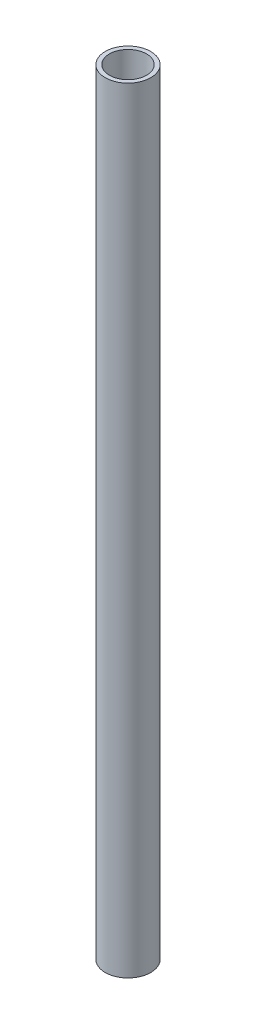
ISO-10303-21;
HEADER;
FILE_DESCRIPTION(('STEP AP214'),'2;1');
FILE_NAME('part.step','',(''),(''),'','','');
FILE_SCHEMA(('AUTOMOTIVE_DESIGN { 1 0 10303 214 1 1 1 1 }'));
ENDSEC;
DATA;
#1=APPLICATION_CONTEXT('core data for automotive mechanical design processes');
#2=APPLICATION_PROTOCOL_DEFINITION('international standard','automotive_design',2000,#1);
#3=PRODUCT_CONTEXT('',#1,'mechanical');
#4=PRODUCT('Part','Part','',(#3));
#5=PRODUCT_RELATED_PRODUCT_CATEGORY('part','',(#4));
#6=PRODUCT_DEFINITION_FORMATION('','',#4);
#7=PRODUCT_DEFINITION_CONTEXT('part definition',#1,'design');
#8=PRODUCT_DEFINITION('design','',#6,#7);
#9=PRODUCT_DEFINITION_SHAPE('','',#8);
#10=(LENGTH_UNIT() NAMED_UNIT(*) SI_UNIT(.MILLI.,.METRE.));
#11=(NAMED_UNIT(*) PLANE_ANGLE_UNIT() SI_UNIT($,.RADIAN.));
#12=(NAMED_UNIT(*) SI_UNIT($,.STERADIAN.) SOLID_ANGLE_UNIT());
#13=UNCERTAINTY_MEASURE_WITH_UNIT(LENGTH_MEASURE(1.E-05),#10,'distance_accuracy_value','');
#14=(GEOMETRIC_REPRESENTATION_CONTEXT(3) GLOBAL_UNCERTAINTY_ASSIGNED_CONTEXT((#13)) GLOBAL_UNIT_ASSIGNED_CONTEXT((#10,
#11,#12)) REPRESENTATION_CONTEXT('',''));
#15=CARTESIAN_POINT('',(0.,0.,0.));
#16=DIRECTION('',(0.,0.,1.));
#17=DIRECTION('',(1.,0.,0.));
#18=AXIS2_PLACEMENT_3D('',#15,#16,#17);
#19=CARTESIAN_POINT('',(0.,480.44,0.));
#20=DIRECTION('',(0.,1.,0.));
#21=DIRECTION('',(0.,0.,1.));
#22=AXIS2_PLACEMENT_3D('',#19,#20,#21);
#23=PLANE('',#22);
#24=CARTESIAN_POINT('',(0.,480.44,0.));
#25=DIRECTION('',(0.,1.,0.));
#26=DIRECTION('',(0.,0.,1.));
#27=AXIS2_PLACEMENT_3D('',#24,#25,#26);
#28=CIRCLE('',#27,14.1);
#29=CARTESIAN_POINT('',(0.,480.44,14.1));
#30=VERTEX_POINT('',#29);
#31=EDGE_CURVE('E12',#30,#30,#28,.T.);
#32=ORIENTED_EDGE('',*,*,#31,.T.);
#33=EDGE_LOOP('',(#32));
#34=FACE_BOUND('',#33,.T.);
#35=CARTESIAN_POINT('',(0.,480.44,0.));
#36=DIRECTION('',(0.,1.,0.));
#37=DIRECTION('',(0.,0.,1.));
#38=AXIS2_PLACEMENT_3D('',#35,#36,#37);
#39=CIRCLE('',#38,11.5);
#40=CARTESIAN_POINT('',(0.,480.44,11.5));
#41=VERTEX_POINT('',#40);
#42=EDGE_CURVE('E53',#41,#41,#39,.T.);
#43=ORIENTED_EDGE('',*,*,#42,.F.);
#44=EDGE_LOOP('',(#43));
#45=FACE_BOUND('',#44,.T.);
#46=ADVANCED_FACE('F42',(#34,#45),#23,.T.);
#47=CARTESIAN_POINT('',(0.,0.,0.));
#48=DIRECTION('',(0.,1.,0.));
#49=DIRECTION('',(0.,0.,1.));
#50=AXIS2_PLACEMENT_3D('',#47,#48,#49);
#51=PLANE('',#50);
#52=CARTESIAN_POINT('',(0.,0.,0.));
#53=DIRECTION('',(0.,1.,0.));
#54=DIRECTION('',(0.,0.,1.));
#55=AXIS2_PLACEMENT_3D('',#52,#53,#54);
#56=CIRCLE('',#55,14.1);
#57=CARTESIAN_POINT('',(0.,0.,14.1));
#58=VERTEX_POINT('',#57);
#59=EDGE_CURVE('E46',#58,#58,#56,.T.);
#60=ORIENTED_EDGE('',*,*,#59,.F.);
#61=EDGE_LOOP('',(#60));
#62=FACE_BOUND('',#61,.T.);
#63=CARTESIAN_POINT('',(0.,0.,0.));
#64=DIRECTION('',(0.,1.,0.));
#65=DIRECTION('',(0.,0.,1.));
#66=AXIS2_PLACEMENT_3D('',#63,#64,#65);
#67=CIRCLE('',#66,11.5);
#68=CARTESIAN_POINT('',(0.,0.,11.5));
#69=VERTEX_POINT('',#68);
#70=EDGE_CURVE('E55',#69,#69,#67,.T.);
#71=ORIENTED_EDGE('',*,*,#70,.T.);
#72=EDGE_LOOP('',(#71));
#73=FACE_BOUND('',#72,.T.);
#74=ADVANCED_FACE('F65',(#62,#73),#51,.F.);
#75=CARTESIAN_POINT('',(0.,480.44,0.));
#76=DIRECTION('',(0.,-1.,0.));
#77=DIRECTION('',(0.,0.,-1.));
#78=AXIS2_PLACEMENT_3D('',#75,#76,#77);
#79=CYLINDRICAL_SURFACE('',#78,14.1);
#80=ORIENTED_EDGE('',*,*,#31,.F.);
#81=EDGE_LOOP('',(#80));
#82=FACE_BOUND('',#81,.T.);
#83=ORIENTED_EDGE('',*,*,#59,.T.);
#84=EDGE_LOOP('',(#83));
#85=FACE_BOUND('',#84,.T.);
#86=ADVANCED_FACE('F44',(#82,#85),#79,.T.);
#87=CARTESIAN_POINT('',(0.,480.44,0.));
#88=DIRECTION('',(0.,-1.,0.));
#89=DIRECTION('',(0.,0.,-1.));
#90=AXIS2_PLACEMENT_3D('',#87,#88,#89);
#91=CYLINDRICAL_SURFACE('',#90,11.5);
#92=ORIENTED_EDGE('',*,*,#42,.T.);
#93=EDGE_LOOP('',(#92));
#94=FACE_BOUND('',#93,.T.);
#95=ORIENTED_EDGE('',*,*,#70,.F.);
#96=EDGE_LOOP('',(#95));
#97=FACE_BOUND('',#96,.T.);
#98=ADVANCED_FACE('F61',(#94,#97),#91,.F.);
#99=CLOSED_SHELL('',(#46,#74,#86,#98));
#100=MANIFOLD_SOLID_BREP('B2',#99);
#101=ADVANCED_BREP_SHAPE_REPRESENTATION('',(#18,#100),#14);
#102=SHAPE_DEFINITION_REPRESENTATION(#9,#101);
ENDSEC;
END-ISO-10303-21;
